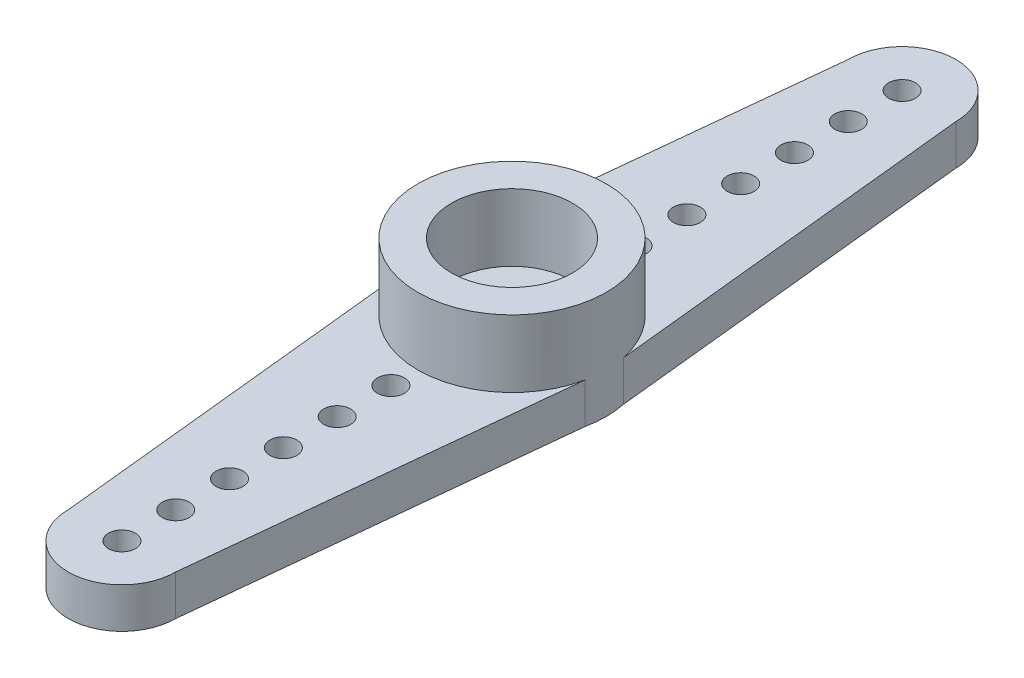
ISO-10303-21;
HEADER;
FILE_DESCRIPTION(('STEP AP214'),'2;1');
FILE_NAME('part.step','',(''),(''),'','','');
FILE_SCHEMA(('AUTOMOTIVE_DESIGN { 1 0 10303 214 1 1 1 1 }'));
ENDSEC;
DATA;
#1=APPLICATION_CONTEXT('core data for automotive mechanical design processes');
#2=APPLICATION_PROTOCOL_DEFINITION('international standard','automotive_design',2000,#1);
#3=PRODUCT_CONTEXT('',#1,'mechanical');
#4=PRODUCT('Part','Part','',(#3));
#5=PRODUCT_RELATED_PRODUCT_CATEGORY('part','',(#4));
#6=PRODUCT_DEFINITION_FORMATION('','',#4);
#7=PRODUCT_DEFINITION_CONTEXT('part definition',#1,'design');
#8=PRODUCT_DEFINITION('design','',#6,#7);
#9=PRODUCT_DEFINITION_SHAPE('','',#8);
#10=(LENGTH_UNIT() NAMED_UNIT(*) SI_UNIT(.MILLI.,.METRE.));
#11=(NAMED_UNIT(*) PLANE_ANGLE_UNIT() SI_UNIT($,.RADIAN.));
#12=(NAMED_UNIT(*) SI_UNIT($,.STERADIAN.) SOLID_ANGLE_UNIT());
#13=UNCERTAINTY_MEASURE_WITH_UNIT(LENGTH_MEASURE(1.E-05),#10,'distance_accuracy_value','');
#14=(GEOMETRIC_REPRESENTATION_CONTEXT(3) GLOBAL_UNCERTAINTY_ASSIGNED_CONTEXT((#13)) GLOBAL_UNIT_ASSIGNED_CONTEXT((#10,
#11,#12)) REPRESENTATION_CONTEXT('',''));
#15=CARTESIAN_POINT('',(0.,0.,0.));
#16=DIRECTION('',(0.,0.,1.));
#17=DIRECTION('',(1.,0.,0.));
#18=AXIS2_PLACEMENT_3D('',#15,#16,#17);
#19=CARTESIAN_POINT('',(0.,1.5,-14.5));
#20=DIRECTION('',(0.,1.,0.));
#21=DIRECTION('',(0.,0.,1.));
#22=AXIS2_PLACEMENT_3D('',#19,#20,#21);
#23=PLANE('',#22);
#24=CARTESIAN_POINT('',(0.,1.5,0.));
#25=DIRECTION('',(0.,1.,0.));
#26=DIRECTION('',(0.,0.,1.));
#27=AXIS2_PLACEMENT_3D('',#24,#25,#26);
#28=CIRCLE('',#27,3.5);
#29=CARTESIAN_POINT('',(3.42588235294118,1.5,-0.716470588235295));
#30=VERTEX_POINT('',#29);
#31=CARTESIAN_POINT('',(-3.42588235294118,1.5,-0.716470588235295));
#32=VERTEX_POINT('',#31);
#33=EDGE_CURVE('E11',#30,#32,#28,.T.);
#34=ORIENTED_EDGE('',*,*,#33,.F.);
#35=DIRECTION('',(-0.102899151085505,0.,-0.994691793826551));
#36=VECTOR('',#35,1.);
#37=CARTESIAN_POINT('',(2.,1.5,-14.5));
#38=LINE('',#37,#36);
#39=CARTESIAN_POINT('',(2.,1.5,-14.5));
#40=VERTEX_POINT('',#39);
#41=EDGE_CURVE('E51',#30,#40,#38,.T.);
#42=ORIENTED_EDGE('',*,*,#41,.T.);
#43=CARTESIAN_POINT('',(0.,1.5,-14.5));
#44=DIRECTION('',(0.,1.,0.));
#45=DIRECTION('',(0.,0.,1.));
#46=AXIS2_PLACEMENT_3D('',#43,#44,#45);
#47=CIRCLE('',#46,2.);
#48=CARTESIAN_POINT('',(-2.,1.5,-14.5));
#49=VERTEX_POINT('',#48);
#50=EDGE_CURVE('E157',#40,#49,#47,.T.);
#51=ORIENTED_EDGE('',*,*,#50,.T.);
#52=DIRECTION('',(-0.102899151085505,0.,0.994691793826551));
#53=VECTOR('',#52,1.);
#54=CARTESIAN_POINT('',(-2.,1.5,-14.5));
#55=LINE('',#54,#53);
#56=EDGE_CURVE('E96',#49,#32,#55,.T.);
#57=ORIENTED_EDGE('',*,*,#56,.T.);
#58=EDGE_LOOP('',(#34,#42,#51,#57));
#59=FACE_BOUND('',#58,.T.);
#60=CARTESIAN_POINT('',(1.04744440165294E-13,1.5,-4.50000000000001));
#61=DIRECTION('',(0.,1.,0.));
#62=DIRECTION('',(0.,0.,1.));
#63=AXIS2_PLACEMENT_3D('',#60,#61,#62);
#64=CIRCLE('',#63,0.5);
#65=CARTESIAN_POINT('',(1.04744440165294E-13,1.5,-4.00000000000001));
#66=VERTEX_POINT('',#65);
#67=EDGE_CURVE('E212',#66,#66,#64,.T.);
#68=ORIENTED_EDGE('',*,*,#67,.F.);
#69=EDGE_LOOP('',(#68));
#70=FACE_BOUND('',#69,.T.);
#71=CARTESIAN_POINT('',(0.,1.5,-8.50000000000001));
#72=DIRECTION('',(0.,1.,0.));
#73=DIRECTION('',(0.,0.,1.));
#74=AXIS2_PLACEMENT_3D('',#71,#72,#73);
#75=CIRCLE('',#74,0.5);
#76=CARTESIAN_POINT('',(0.,1.5,-8.00000000000001));
#77=VERTEX_POINT('',#76);
#78=EDGE_CURVE('E216',#77,#77,#75,.T.);
#79=ORIENTED_EDGE('',*,*,#78,.F.);
#80=EDGE_LOOP('',(#79));
#81=FACE_BOUND('',#80,.T.);
#82=CARTESIAN_POINT('',(0.,1.5,-12.5));
#83=DIRECTION('',(0.,1.,0.));
#84=DIRECTION('',(0.,0.,1.));
#85=AXIS2_PLACEMENT_3D('',#82,#83,#84);
#86=CIRCLE('',#85,0.5);
#87=CARTESIAN_POINT('',(0.,1.5,-12.));
#88=VERTEX_POINT('',#87);
#89=EDGE_CURVE('E220',#88,#88,#86,.T.);
#90=ORIENTED_EDGE('',*,*,#89,.F.);
#91=EDGE_LOOP('',(#90));
#92=FACE_BOUND('',#91,.T.);
#93=CARTESIAN_POINT('',(0.,1.5,-14.5));
#94=DIRECTION('',(0.,1.,0.));
#95=DIRECTION('',(0.,0.,1.));
#96=AXIS2_PLACEMENT_3D('',#93,#94,#95);
#97=CIRCLE('',#96,0.5);
#98=CARTESIAN_POINT('',(0.,1.5,-14.));
#99=VERTEX_POINT('',#98);
#100=EDGE_CURVE('E224',#99,#99,#97,.T.);
#101=ORIENTED_EDGE('',*,*,#100,.F.);
#102=EDGE_LOOP('',(#101));
#103=FACE_BOUND('',#102,.T.);
#104=CARTESIAN_POINT('',(0.,1.5,-10.5));
#105=DIRECTION('',(0.,1.,0.));
#106=DIRECTION('',(0.,0.,1.));
#107=AXIS2_PLACEMENT_3D('',#104,#105,#106);
#108=CIRCLE('',#107,0.5);
#109=CARTESIAN_POINT('',(0.,1.5,-10.));
#110=VERTEX_POINT('',#109);
#111=EDGE_CURVE('E228',#110,#110,#108,.T.);
#112=ORIENTED_EDGE('',*,*,#111,.F.);
#113=EDGE_LOOP('',(#112));
#114=FACE_BOUND('',#113,.T.);
#115=CARTESIAN_POINT('',(0.,1.5,-6.50000000000001));
#116=DIRECTION('',(0.,1.,0.));
#117=DIRECTION('',(0.,0.,1.));
#118=AXIS2_PLACEMENT_3D('',#115,#116,#117);
#119=CIRCLE('',#118,0.5);
#120=CARTESIAN_POINT('',(0.,1.5,-6.00000000000001));
#121=VERTEX_POINT('',#120);
#122=EDGE_CURVE('E231',#121,#121,#119,.T.);
#123=ORIENTED_EDGE('',*,*,#122,.F.);
#124=EDGE_LOOP('',(#123));
#125=FACE_BOUND('',#124,.T.);
#126=ADVANCED_FACE('F32',(#59,#70,#81,#92,#103,#114,#125),#23,.T.);
#127=CARTESIAN_POINT('',(-3.42588235294118,1.5,0.716470588235297));
#128=VERTEX_POINT('',#127);
#129=CARTESIAN_POINT('',(3.42588235294118,1.5,0.716470588235302));
#130=VERTEX_POINT('',#129);
#131=EDGE_CURVE('E42',#128,#130,#28,.T.);
#132=ORIENTED_EDGE('',*,*,#131,.F.);
#133=DIRECTION('',(0.102899151085505,0.,0.994691793826551));
#134=VECTOR('',#133,1.);
#135=CARTESIAN_POINT('',(-3.42588235294118,1.5,0.716470588235298));
#136=LINE('',#135,#134);
#137=CARTESIAN_POINT('',(-2.,1.5,14.5));
#138=VERTEX_POINT('',#137);
#139=EDGE_CURVE('E117',#128,#138,#136,.T.);
#140=ORIENTED_EDGE('',*,*,#139,.T.);
#141=CARTESIAN_POINT('',(0.,1.5,14.5));
#142=DIRECTION('',(0.,1.,0.));
#143=DIRECTION('',(0.,0.,1.));
#144=AXIS2_PLACEMENT_3D('',#141,#142,#143);
#145=CIRCLE('',#144,2.);
#146=CARTESIAN_POINT('',(2.,1.5,14.5));
#147=VERTEX_POINT('',#146);
#148=EDGE_CURVE('E109',#138,#147,#145,.T.);
#149=ORIENTED_EDGE('',*,*,#148,.T.);
#150=DIRECTION('',(0.102899151085505,0.,-0.994691793826551));
#151=VECTOR('',#150,1.);
#152=CARTESIAN_POINT('',(3.42588235294118,1.5,0.716470588235298));
#153=LINE('',#152,#151);
#154=EDGE_CURVE('E114',#147,#130,#153,.T.);
#155=ORIENTED_EDGE('',*,*,#154,.T.);
#156=EDGE_LOOP('',(#132,#140,#149,#155));
#157=FACE_BOUND('',#156,.T.);
#158=CARTESIAN_POINT('',(0.,1.5,6.5));
#159=DIRECTION('',(0.,1.,0.));
#160=DIRECTION('',(0.,0.,1.));
#161=AXIS2_PLACEMENT_3D('',#158,#159,#160);
#162=CIRCLE('',#161,0.5);
#163=CARTESIAN_POINT('',(0.,1.5,7.));
#164=VERTEX_POINT('',#163);
#165=EDGE_CURVE('E264',#164,#164,#162,.T.);
#166=ORIENTED_EDGE('',*,*,#165,.F.);
#167=EDGE_LOOP('',(#166));
#168=FACE_BOUND('',#167,.T.);
#169=CARTESIAN_POINT('',(0.,1.5,10.5));
#170=DIRECTION('',(0.,1.,0.));
#171=DIRECTION('',(0.,0.,1.));
#172=AXIS2_PLACEMENT_3D('',#169,#170,#171);
#173=CIRCLE('',#172,0.5);
#174=CARTESIAN_POINT('',(0.,1.5,11.));
#175=VERTEX_POINT('',#174);
#176=EDGE_CURVE('E276',#175,#175,#173,.T.);
#177=ORIENTED_EDGE('',*,*,#176,.F.);
#178=EDGE_LOOP('',(#177));
#179=FACE_BOUND('',#178,.T.);
#180=CARTESIAN_POINT('',(0.,1.5,14.5));
#181=DIRECTION('',(0.,1.,0.));
#182=DIRECTION('',(0.,0.,1.));
#183=AXIS2_PLACEMENT_3D('',#180,#181,#182);
#184=CIRCLE('',#183,0.5);
#185=CARTESIAN_POINT('',(0.,1.5,15.));
#186=VERTEX_POINT('',#185);
#187=EDGE_CURVE('E201',#186,#186,#184,.T.);
#188=ORIENTED_EDGE('',*,*,#187,.F.);
#189=EDGE_LOOP('',(#188));
#190=FACE_BOUND('',#189,.T.);
#191=CARTESIAN_POINT('',(0.,1.5,12.5));
#192=DIRECTION('',(0.,1.,0.));
#193=DIRECTION('',(0.,0.,1.));
#194=AXIS2_PLACEMENT_3D('',#191,#192,#193);
#195=CIRCLE('',#194,0.5);
#196=CARTESIAN_POINT('',(0.,1.5,13.));
#197=VERTEX_POINT('',#196);
#198=EDGE_CURVE('E282',#197,#197,#195,.T.);
#199=ORIENTED_EDGE('',*,*,#198,.F.);
#200=EDGE_LOOP('',(#199));
#201=FACE_BOUND('',#200,.T.);
#202=CARTESIAN_POINT('',(0.,1.5,8.5));
#203=DIRECTION('',(0.,1.,0.));
#204=DIRECTION('',(0.,0.,1.));
#205=AXIS2_PLACEMENT_3D('',#202,#203,#204);
#206=CIRCLE('',#205,0.5);
#207=CARTESIAN_POINT('',(0.,1.5,9.));
#208=VERTEX_POINT('',#207);
#209=EDGE_CURVE('E270',#208,#208,#206,.T.);
#210=ORIENTED_EDGE('',*,*,#209,.F.);
#211=EDGE_LOOP('',(#210));
#212=FACE_BOUND('',#211,.T.);
#213=CARTESIAN_POINT('',(0.,1.5,4.5));
#214=DIRECTION('',(0.,1.,0.));
#215=DIRECTION('',(0.,0.,1.));
#216=AXIS2_PLACEMENT_3D('',#213,#214,#215);
#217=CIRCLE('',#216,0.5);
#218=CARTESIAN_POINT('',(0.,1.5,5.));
#219=VERTEX_POINT('',#218);
#220=EDGE_CURVE('E258',#219,#219,#217,.T.);
#221=ORIENTED_EDGE('',*,*,#220,.F.);
#222=EDGE_LOOP('',(#221));
#223=FACE_BOUND('',#222,.T.);
#224=ADVANCED_FACE('F111',(#157,#168,#179,#190,#201,#212,#223),#23,.T.);
#225=CARTESIAN_POINT('',(0.,0.,-14.5));
#226=DIRECTION('',(0.,1.,0.));
#227=DIRECTION('',(0.,0.,1.));
#228=AXIS2_PLACEMENT_3D('',#225,#226,#227);
#229=PLANE('',#228);
#230=CARTESIAN_POINT('',(0.,0.,0.));
#231=DIRECTION('',(0.,-1.,0.));
#232=DIRECTION('',(0.,0.,-1.));
#233=AXIS2_PLACEMENT_3D('',#230,#231,#232);
#234=CIRCLE('',#233,2.5);
#235=CARTESIAN_POINT('',(0.,0.,-2.5));
#236=VERTEX_POINT('',#235);
#237=EDGE_CURVE('E536',#236,#236,#234,.T.);
#238=ORIENTED_EDGE('',*,*,#237,.F.);
#239=EDGE_LOOP('',(#238));
#240=FACE_BOUND('',#239,.T.);
#241=CARTESIAN_POINT('',(0.,0.,-6.50000000000001));
#242=DIRECTION('',(0.,1.,0.));
#243=DIRECTION('',(0.,0.,1.));
#244=AXIS2_PLACEMENT_3D('',#241,#242,#243);
#245=CIRCLE('',#244,0.5);
#246=CARTESIAN_POINT('',(0.,0.,-6.00000000000001));
#247=VERTEX_POINT('',#246);
#248=EDGE_CURVE('E234',#247,#247,#245,.T.);
#249=ORIENTED_EDGE('',*,*,#248,.T.);
#250=EDGE_LOOP('',(#249));
#251=FACE_BOUND('',#250,.T.);
#252=CARTESIAN_POINT('',(0.,0.,-10.5));
#253=DIRECTION('',(0.,1.,0.));
#254=DIRECTION('',(0.,0.,1.));
#255=AXIS2_PLACEMENT_3D('',#252,#253,#254);
#256=CIRCLE('',#255,0.5);
#257=CARTESIAN_POINT('',(0.,0.,-10.));
#258=VERTEX_POINT('',#257);
#259=EDGE_CURVE('E244',#258,#258,#256,.T.);
#260=ORIENTED_EDGE('',*,*,#259,.T.);
#261=EDGE_LOOP('',(#260));
#262=FACE_BOUND('',#261,.T.);
#263=CARTESIAN_POINT('',(0.,0.,-14.5));
#264=DIRECTION('',(0.,1.,0.));
#265=DIRECTION('',(0.,0.,1.));
#266=AXIS2_PLACEMENT_3D('',#263,#264,#265);
#267=CIRCLE('',#266,0.5);
#268=CARTESIAN_POINT('',(0.,0.,-14.));
#269=VERTEX_POINT('',#268);
#270=EDGE_CURVE('E251',#269,#269,#267,.T.);
#271=ORIENTED_EDGE('',*,*,#270,.T.);
#272=EDGE_LOOP('',(#271));
#273=FACE_BOUND('',#272,.T.);
#274=CARTESIAN_POINT('',(0.,0.,6.5));
#275=DIRECTION('',(0.,1.,0.));
#276=DIRECTION('',(0.,0.,1.));
#277=AXIS2_PLACEMENT_3D('',#274,#275,#276);
#278=CIRCLE('',#277,0.5);
#279=CARTESIAN_POINT('',(0.,0.,7.));
#280=VERTEX_POINT('',#279);
#281=EDGE_CURVE('E261',#280,#280,#278,.T.);
#282=ORIENTED_EDGE('',*,*,#281,.T.);
#283=EDGE_LOOP('',(#282));
#284=FACE_BOUND('',#283,.T.);
#285=CARTESIAN_POINT('',(0.,0.,10.5));
#286=DIRECTION('',(0.,1.,0.));
#287=DIRECTION('',(0.,0.,1.));
#288=AXIS2_PLACEMENT_3D('',#285,#286,#287);
#289=CIRCLE('',#288,0.5);
#290=CARTESIAN_POINT('',(0.,0.,11.));
#291=VERTEX_POINT('',#290);
#292=EDGE_CURVE('E273',#291,#291,#289,.T.);
#293=ORIENTED_EDGE('',*,*,#292,.T.);
#294=EDGE_LOOP('',(#293));
#295=FACE_BOUND('',#294,.T.);
#296=CARTESIAN_POINT('',(0.,0.,14.5));
#297=DIRECTION('',(0.,1.,0.));
#298=DIRECTION('',(0.,0.,1.));
#299=AXIS2_PLACEMENT_3D('',#296,#297,#298);
#300=CIRCLE('',#299,0.5);
#301=CARTESIAN_POINT('',(0.,0.,15.));
#302=VERTEX_POINT('',#301);
#303=EDGE_CURVE('E197',#302,#302,#300,.T.);
#304=ORIENTED_EDGE('',*,*,#303,.T.);
#305=EDGE_LOOP('',(#304));
#306=FACE_BOUND('',#305,.T.);
#307=CARTESIAN_POINT('',(0.,0.,-14.5));
#308=DIRECTION('',(0.,1.,0.));
#309=DIRECTION('',(0.,0.,1.));
#310=AXIS2_PLACEMENT_3D('',#307,#308,#309);
#311=CIRCLE('',#310,2.);
#312=CARTESIAN_POINT('',(2.,0.,-14.5));
#313=VERTEX_POINT('',#312);
#314=CARTESIAN_POINT('',(-2.,0.,-14.5));
#315=VERTEX_POINT('',#314);
#316=EDGE_CURVE('E200',#313,#315,#311,.T.);
#317=ORIENTED_EDGE('',*,*,#316,.F.);
#318=DIRECTION('',(-0.102899151085505,0.,-0.994691793826551));
#319=VECTOR('',#318,1.);
#320=CARTESIAN_POINT('',(2.,0.,-14.5));
#321=LINE('',#320,#319);
#322=CARTESIAN_POINT('',(3.42588235294118,0.,-0.716470588235295));
#323=VERTEX_POINT('',#322);
#324=EDGE_CURVE('E87',#323,#313,#321,.T.);
#325=ORIENTED_EDGE('',*,*,#324,.F.);
#326=CARTESIAN_POINT('',(0.,0.,0.));
#327=DIRECTION('',(0.,1.,0.));
#328=DIRECTION('',(0.,0.,1.));
#329=AXIS2_PLACEMENT_3D('',#326,#327,#328);
#330=CIRCLE('',#329,3.5);
#331=CARTESIAN_POINT('',(3.42588235294118,0.,0.716470588235298));
#332=VERTEX_POINT('',#331);
#333=EDGE_CURVE('E81',#332,#323,#330,.T.);
#334=ORIENTED_EDGE('',*,*,#333,.F.);
#335=DIRECTION('',(0.102899151085505,0.,-0.994691793826551));
#336=VECTOR('',#335,1.);
#337=CARTESIAN_POINT('',(3.42588235294118,0.,0.716470588235298));
#338=LINE('',#337,#336);
#339=CARTESIAN_POINT('',(2.,0.,14.5));
#340=VERTEX_POINT('',#339);
#341=EDGE_CURVE('E188',#340,#332,#338,.T.);
#342=ORIENTED_EDGE('',*,*,#341,.F.);
#343=CARTESIAN_POINT('',(0.,0.,14.5));
#344=DIRECTION('',(0.,1.,0.));
#345=DIRECTION('',(0.,0.,1.));
#346=AXIS2_PLACEMENT_3D('',#343,#344,#345);
#347=CIRCLE('',#346,2.);
#348=CARTESIAN_POINT('',(-2.,0.,14.5));
#349=VERTEX_POINT('',#348);
#350=EDGE_CURVE('E126',#349,#340,#347,.T.);
#351=ORIENTED_EDGE('',*,*,#350,.F.);
#352=DIRECTION('',(0.102899151085505,0.,0.994691793826551));
#353=VECTOR('',#352,1.);
#354=CARTESIAN_POINT('',(-3.42588235294118,0.,0.716470588235298));
#355=LINE('',#354,#353);
#356=CARTESIAN_POINT('',(-3.42588235294118,0.,0.716470588235297));
#357=VERTEX_POINT('',#356);
#358=EDGE_CURVE('E181',#357,#349,#355,.T.);
#359=ORIENTED_EDGE('',*,*,#358,.F.);
#360=CARTESIAN_POINT('',(0.,0.,0.));
#361=DIRECTION('',(0.,1.,0.));
#362=DIRECTION('',(0.,0.,1.));
#363=AXIS2_PLACEMENT_3D('',#360,#361,#362);
#364=CIRCLE('',#363,3.5);
#365=CARTESIAN_POINT('',(-3.42588235294118,0.,-0.716470588235295));
#366=VERTEX_POINT('',#365);
#367=EDGE_CURVE('E186',#366,#357,#364,.T.);
#368=ORIENTED_EDGE('',*,*,#367,.F.);
#369=DIRECTION('',(-0.102899151085505,0.,0.994691793826551));
#370=VECTOR('',#369,1.);
#371=CARTESIAN_POINT('',(-2.,0.,-14.5));
#372=LINE('',#371,#370);
#373=EDGE_CURVE('E190',#315,#366,#372,.T.);
#374=ORIENTED_EDGE('',*,*,#373,.F.);
#375=EDGE_LOOP('',(#317,#325,#334,#342,#351,#359,#368,#374));
#376=FACE_BOUND('',#375,.T.);
#377=CARTESIAN_POINT('',(0.,0.,12.5));
#378=DIRECTION('',(0.,1.,0.));
#379=DIRECTION('',(0.,0.,1.));
#380=AXIS2_PLACEMENT_3D('',#377,#378,#379);
#381=CIRCLE('',#380,0.5);
#382=CARTESIAN_POINT('',(0.,0.,13.));
#383=VERTEX_POINT('',#382);
#384=EDGE_CURVE('E279',#383,#383,#381,.T.);
#385=ORIENTED_EDGE('',*,*,#384,.T.);
#386=EDGE_LOOP('',(#385));
#387=FACE_BOUND('',#386,.T.);
#388=CARTESIAN_POINT('',(0.,0.,8.5));
#389=DIRECTION('',(0.,1.,0.));
#390=DIRECTION('',(0.,0.,1.));
#391=AXIS2_PLACEMENT_3D('',#388,#389,#390);
#392=CIRCLE('',#391,0.5);
#393=CARTESIAN_POINT('',(0.,0.,9.));
#394=VERTEX_POINT('',#393);
#395=EDGE_CURVE('E267',#394,#394,#392,.T.);
#396=ORIENTED_EDGE('',*,*,#395,.T.);
#397=EDGE_LOOP('',(#396));
#398=FACE_BOUND('',#397,.T.);
#399=CARTESIAN_POINT('',(0.,0.,4.5));
#400=DIRECTION('',(0.,1.,0.));
#401=DIRECTION('',(0.,0.,1.));
#402=AXIS2_PLACEMENT_3D('',#399,#400,#401);
#403=CIRCLE('',#402,0.5);
#404=CARTESIAN_POINT('',(0.,0.,5.));
#405=VERTEX_POINT('',#404);
#406=EDGE_CURVE('E255',#405,#405,#403,.T.);
#407=ORIENTED_EDGE('',*,*,#406,.T.);
#408=EDGE_LOOP('',(#407));
#409=FACE_BOUND('',#408,.T.);
#410=CARTESIAN_POINT('',(0.,0.,-12.5));
#411=DIRECTION('',(0.,1.,0.));
#412=DIRECTION('',(0.,0.,1.));
#413=AXIS2_PLACEMENT_3D('',#410,#411,#412);
#414=CIRCLE('',#413,0.5);
#415=CARTESIAN_POINT('',(0.,0.,-12.));
#416=VERTEX_POINT('',#415);
#417=EDGE_CURVE('E247',#416,#416,#414,.T.);
#418=ORIENTED_EDGE('',*,*,#417,.T.);
#419=EDGE_LOOP('',(#418));
#420=FACE_BOUND('',#419,.T.);
#421=CARTESIAN_POINT('',(0.,0.,-8.50000000000001));
#422=DIRECTION('',(0.,1.,0.));
#423=DIRECTION('',(0.,0.,1.));
#424=AXIS2_PLACEMENT_3D('',#421,#422,#423);
#425=CIRCLE('',#424,0.5);
#426=CARTESIAN_POINT('',(0.,0.,-8.00000000000001));
#427=VERTEX_POINT('',#426);
#428=EDGE_CURVE('E233',#427,#427,#425,.T.);
#429=ORIENTED_EDGE('',*,*,#428,.T.);
#430=EDGE_LOOP('',(#429));
#431=FACE_BOUND('',#430,.T.);
#432=CARTESIAN_POINT('',(1.04744440165294E-13,0.,-4.50000000000001));
#433=DIRECTION('',(0.,1.,0.));
#434=DIRECTION('',(0.,0.,1.));
#435=AXIS2_PLACEMENT_3D('',#432,#433,#434);
#436=CIRCLE('',#435,0.5);
#437=CARTESIAN_POINT('',(1.04744440165294E-13,0.,-4.00000000000001));
#438=VERTEX_POINT('',#437);
#439=EDGE_CURVE('E241',#438,#438,#436,.T.);
#440=ORIENTED_EDGE('',*,*,#439,.T.);
#441=EDGE_LOOP('',(#440));
#442=FACE_BOUND('',#441,.T.);
#443=ADVANCED_FACE('F184',(#240,#251,#262,#273,#284,#295,#306,#376,#387,#398,#409,#420,#431,
#442),#229,.F.);
#444=CARTESIAN_POINT('',(0.,1.5,-14.5));
#445=DIRECTION('',(0.,-1.,0.));
#446=DIRECTION('',(0.,0.,-1.));
#447=AXIS2_PLACEMENT_3D('',#444,#445,#446);
#448=CYLINDRICAL_SURFACE('',#447,2.);
#449=ORIENTED_EDGE('',*,*,#316,.T.);
#450=DIRECTION('',(0.,-1.,0.));
#451=VECTOR('',#450,1.);
#452=CARTESIAN_POINT('',(-2.,1.5,-14.5));
#453=LINE('',#452,#451);
#454=EDGE_CURVE('E145',#49,#315,#453,.T.);
#455=ORIENTED_EDGE('',*,*,#454,.F.);
#456=ORIENTED_EDGE('',*,*,#50,.F.);
#457=DIRECTION('',(0.,-1.,0.));
#458=VECTOR('',#457,1.);
#459=CARTESIAN_POINT('',(2.,1.5,-14.5));
#460=LINE('',#459,#458);
#461=EDGE_CURVE('E135',#40,#313,#460,.T.);
#462=ORIENTED_EDGE('',*,*,#461,.T.);
#463=EDGE_LOOP('',(#449,#455,#456,#462));
#464=FACE_BOUND('',#463,.T.);
#465=ADVANCED_FACE('F34',(#464),#448,.T.);
#466=CARTESIAN_POINT('',(-2.,1.5,-14.5));
#467=DIRECTION('',(0.994691793826551,0.,0.102899151085505));
#468=DIRECTION('',(0.102899151085505,0.,-0.994691793826551));
#469=AXIS2_PLACEMENT_3D('',#466,#467,#468);
#470=PLANE('',#469);
#471=ORIENTED_EDGE('',*,*,#373,.T.);
#472=DIRECTION('',(0.,-1.,0.));
#473=VECTOR('',#472,1.);
#474=CARTESIAN_POINT('',(-3.42588235294118,1.5,-0.716470588235295));
#475=LINE('',#474,#473);
#476=EDGE_CURVE('E160',#32,#366,#475,.T.);
#477=ORIENTED_EDGE('',*,*,#476,.F.);
#478=ORIENTED_EDGE('',*,*,#56,.F.);
#479=ORIENTED_EDGE('',*,*,#454,.T.);
#480=EDGE_LOOP('',(#471,#477,#478,#479));
#481=FACE_BOUND('',#480,.T.);
#482=ADVANCED_FACE('F202',(#481),#470,.F.);
#483=CARTESIAN_POINT('',(-3.42588235294118,1.5,0.716470588235298));
#484=DIRECTION('',(0.994691793826551,0.,-0.102899151085505));
#485=DIRECTION('',(-0.102899151085505,0.,-0.994691793826551));
#486=AXIS2_PLACEMENT_3D('',#483,#484,#485);
#487=PLANE('',#486);
#488=ORIENTED_EDGE('',*,*,#358,.T.);
#489=DIRECTION('',(0.,-1.,0.));
#490=VECTOR('',#489,1.);
#491=CARTESIAN_POINT('',(-2.,1.5,14.5));
#492=LINE('',#491,#490);
#493=EDGE_CURVE('E129',#138,#349,#492,.T.);
#494=ORIENTED_EDGE('',*,*,#493,.F.);
#495=ORIENTED_EDGE('',*,*,#139,.F.);
#496=DIRECTION('',(0.,-1.,0.));
#497=VECTOR('',#496,1.);
#498=CARTESIAN_POINT('',(-3.42588235294118,1.5,0.716470588235297));
#499=LINE('',#498,#497);
#500=EDGE_CURVE('E146',#128,#357,#499,.T.);
#501=ORIENTED_EDGE('',*,*,#500,.T.);
#502=EDGE_LOOP('',(#488,#494,#495,#501));
#503=FACE_BOUND('',#502,.T.);
#504=ADVANCED_FACE('F180',(#503),#487,.F.);
#505=CARTESIAN_POINT('',(0.,1.5,14.5));
#506=DIRECTION('',(0.,-1.,0.));
#507=DIRECTION('',(0.,0.,-1.));
#508=AXIS2_PLACEMENT_3D('',#505,#506,#507);
#509=CYLINDRICAL_SURFACE('',#508,2.);
#510=ORIENTED_EDGE('',*,*,#350,.T.);
#511=DIRECTION('',(0.,-1.,0.));
#512=VECTOR('',#511,1.);
#513=CARTESIAN_POINT('',(2.,1.5,14.5));
#514=LINE('',#513,#512);
#515=EDGE_CURVE('E123',#147,#340,#514,.T.);
#516=ORIENTED_EDGE('',*,*,#515,.F.);
#517=ORIENTED_EDGE('',*,*,#148,.F.);
#518=ORIENTED_EDGE('',*,*,#493,.T.);
#519=EDGE_LOOP('',(#510,#516,#517,#518));
#520=FACE_BOUND('',#519,.T.);
#521=ADVANCED_FACE('F124',(#520),#509,.T.);
#522=CARTESIAN_POINT('',(3.42588235294118,1.5,0.716470588235298));
#523=DIRECTION('',(-0.994691793826551,0.,-0.102899151085505));
#524=DIRECTION('',(-0.102899151085505,0.,0.994691793826551));
#525=AXIS2_PLACEMENT_3D('',#522,#523,#524);
#526=PLANE('',#525);
#527=ORIENTED_EDGE('',*,*,#341,.T.);
#528=DIRECTION('',(0.,-1.,0.));
#529=VECTOR('',#528,1.);
#530=CARTESIAN_POINT('',(3.42588235294118,1.5,0.716470588235298));
#531=LINE('',#530,#529);
#532=EDGE_CURVE('E130',#130,#332,#531,.T.);
#533=ORIENTED_EDGE('',*,*,#532,.F.);
#534=ORIENTED_EDGE('',*,*,#154,.F.);
#535=ORIENTED_EDGE('',*,*,#515,.T.);
#536=EDGE_LOOP('',(#527,#533,#534,#535));
#537=FACE_BOUND('',#536,.T.);
#538=ADVANCED_FACE('F133',(#537),#526,.F.);
#539=CARTESIAN_POINT('',(0.,1.5,0.));
#540=DIRECTION('',(0.,-1.,0.));
#541=DIRECTION('',(0.,0.,-1.));
#542=AXIS2_PLACEMENT_3D('',#539,#540,#541);
#543=CYLINDRICAL_SURFACE('',#542,3.5);
#544=ORIENTED_EDGE('',*,*,#333,.T.);
#545=DIRECTION('',(0.,-1.,0.));
#546=VECTOR('',#545,1.);
#547=CARTESIAN_POINT('',(3.42588235294118,1.5,-0.716470588235295));
#548=LINE('',#547,#546);
#549=EDGE_CURVE('E165',#30,#323,#548,.T.);
#550=ORIENTED_EDGE('',*,*,#549,.F.);
#551=ORIENTED_EDGE('',*,*,#33,.T.);
#552=ORIENTED_EDGE('',*,*,#476,.T.);
#553=ORIENTED_EDGE('',*,*,#367,.T.);
#554=ORIENTED_EDGE('',*,*,#500,.F.);
#555=ORIENTED_EDGE('',*,*,#131,.T.);
#556=ORIENTED_EDGE('',*,*,#532,.T.);
#557=EDGE_LOOP('',(#544,#550,#551,#552,#553,#554,#555,#556));
#558=FACE_BOUND('',#557,.T.);
#559=CARTESIAN_POINT('',(0.,4.,0.));
#560=DIRECTION('',(0.,1.,0.));
#561=DIRECTION('',(0.,0.,1.));
#562=AXIS2_PLACEMENT_3D('',#559,#560,#561);
#563=CIRCLE('',#562,3.5);
#564=CARTESIAN_POINT('',(0.,4.,3.5));
#565=VERTEX_POINT('',#564);
#566=EDGE_CURVE('E547',#565,#565,#563,.T.);
#567=ORIENTED_EDGE('',*,*,#566,.F.);
#568=EDGE_LOOP('',(#567));
#569=FACE_BOUND('',#568,.T.);
#570=ADVANCED_FACE('F203',(#558,#569),#543,.T.);
#571=CARTESIAN_POINT('',(2.,1.5,-14.5));
#572=DIRECTION('',(-0.994691793826551,0.,0.102899151085505));
#573=DIRECTION('',(0.102899151085505,0.,0.994691793826551));
#574=AXIS2_PLACEMENT_3D('',#571,#572,#573);
#575=PLANE('',#574);
#576=ORIENTED_EDGE('',*,*,#324,.T.);
#577=ORIENTED_EDGE('',*,*,#461,.F.);
#578=ORIENTED_EDGE('',*,*,#41,.F.);
#579=ORIENTED_EDGE('',*,*,#549,.T.);
#580=EDGE_LOOP('',(#576,#577,#578,#579));
#581=FACE_BOUND('',#580,.T.);
#582=ADVANCED_FACE('F296',(#581),#575,.F.);
#583=CARTESIAN_POINT('',(0.,1.5,14.5));
#584=DIRECTION('',(0.,-1.,0.));
#585=DIRECTION('',(0.,0.,-1.));
#586=AXIS2_PLACEMENT_3D('',#583,#584,#585);
#587=CYLINDRICAL_SURFACE('',#586,0.5);
#588=ORIENTED_EDGE('',*,*,#187,.T.);
#589=EDGE_LOOP('',(#588));
#590=FACE_BOUND('',#589,.T.);
#591=ORIENTED_EDGE('',*,*,#303,.F.);
#592=EDGE_LOOP('',(#591));
#593=FACE_BOUND('',#592,.T.);
#594=ADVANCED_FACE('F293',(#590,#593),#587,.F.);
#595=CARTESIAN_POINT('',(0.,1.5,12.5));
#596=DIRECTION('',(0.,-1.,0.));
#597=DIRECTION('',(0.,0.,-1.));
#598=AXIS2_PLACEMENT_3D('',#595,#596,#597);
#599=CYLINDRICAL_SURFACE('',#598,0.5);
#600=ORIENTED_EDGE('',*,*,#198,.T.);
#601=EDGE_LOOP('',(#600));
#602=FACE_BOUND('',#601,.T.);
#603=ORIENTED_EDGE('',*,*,#384,.F.);
#604=EDGE_LOOP('',(#603));
#605=FACE_BOUND('',#604,.T.);
#606=ADVANCED_FACE('F295',(#602,#605),#599,.F.);
#607=CARTESIAN_POINT('',(0.,1.5,10.5));
#608=DIRECTION('',(0.,-1.,0.));
#609=DIRECTION('',(0.,0.,-1.));
#610=AXIS2_PLACEMENT_3D('',#607,#608,#609);
#611=CYLINDRICAL_SURFACE('',#610,0.5);
#612=ORIENTED_EDGE('',*,*,#176,.T.);
#613=EDGE_LOOP('',(#612));
#614=FACE_BOUND('',#613,.T.);
#615=ORIENTED_EDGE('',*,*,#292,.F.);
#616=EDGE_LOOP('',(#615));
#617=FACE_BOUND('',#616,.T.);
#618=ADVANCED_FACE('F302',(#614,#617),#611,.F.);
#619=CARTESIAN_POINT('',(0.,1.5,8.5));
#620=DIRECTION('',(0.,-1.,0.));
#621=DIRECTION('',(0.,0.,-1.));
#622=AXIS2_PLACEMENT_3D('',#619,#620,#621);
#623=CYLINDRICAL_SURFACE('',#622,0.5);
#624=ORIENTED_EDGE('',*,*,#209,.T.);
#625=EDGE_LOOP('',(#624));
#626=FACE_BOUND('',#625,.T.);
#627=ORIENTED_EDGE('',*,*,#395,.F.);
#628=EDGE_LOOP('',(#627));
#629=FACE_BOUND('',#628,.T.);
#630=ADVANCED_FACE('F423',(#626,#629),#623,.F.);
#631=CARTESIAN_POINT('',(0.,1.5,6.5));
#632=DIRECTION('',(0.,-1.,0.));
#633=DIRECTION('',(0.,0.,-1.));
#634=AXIS2_PLACEMENT_3D('',#631,#632,#633);
#635=CYLINDRICAL_SURFACE('',#634,0.5);
#636=ORIENTED_EDGE('',*,*,#165,.T.);
#637=EDGE_LOOP('',(#636));
#638=FACE_BOUND('',#637,.T.);
#639=ORIENTED_EDGE('',*,*,#281,.F.);
#640=EDGE_LOOP('',(#639));
#641=FACE_BOUND('',#640,.T.);
#642=ADVANCED_FACE('F413',(#638,#641),#635,.F.);
#643=CARTESIAN_POINT('',(0.,1.5,4.5));
#644=DIRECTION('',(0.,-1.,0.));
#645=DIRECTION('',(0.,0.,-1.));
#646=AXIS2_PLACEMENT_3D('',#643,#644,#645);
#647=CYLINDRICAL_SURFACE('',#646,0.5);
#648=ORIENTED_EDGE('',*,*,#220,.T.);
#649=EDGE_LOOP('',(#648));
#650=FACE_BOUND('',#649,.T.);
#651=ORIENTED_EDGE('',*,*,#406,.F.);
#652=EDGE_LOOP('',(#651));
#653=FACE_BOUND('',#652,.T.);
#654=ADVANCED_FACE('F403',(#650,#653),#647,.F.);
#655=CARTESIAN_POINT('',(0.,1.5,-14.5));
#656=DIRECTION('',(0.,-1.,0.));
#657=DIRECTION('',(0.,0.,-1.));
#658=AXIS2_PLACEMENT_3D('',#655,#656,#657);
#659=CYLINDRICAL_SURFACE('',#658,0.5);
#660=ORIENTED_EDGE('',*,*,#100,.T.);
#661=EDGE_LOOP('',(#660));
#662=FACE_BOUND('',#661,.T.);
#663=ORIENTED_EDGE('',*,*,#270,.F.);
#664=EDGE_LOOP('',(#663));
#665=FACE_BOUND('',#664,.T.);
#666=ADVANCED_FACE('F393',(#662,#665),#659,.F.);
#667=CARTESIAN_POINT('',(0.,1.5,-12.5));
#668=DIRECTION('',(0.,-1.,0.));
#669=DIRECTION('',(0.,0.,-1.));
#670=AXIS2_PLACEMENT_3D('',#667,#668,#669);
#671=CYLINDRICAL_SURFACE('',#670,0.5);
#672=ORIENTED_EDGE('',*,*,#89,.T.);
#673=EDGE_LOOP('',(#672));
#674=FACE_BOUND('',#673,.T.);
#675=ORIENTED_EDGE('',*,*,#417,.F.);
#676=EDGE_LOOP('',(#675));
#677=FACE_BOUND('',#676,.T.);
#678=ADVANCED_FACE('F383',(#674,#677),#671,.F.);
#679=CARTESIAN_POINT('',(0.,1.5,-10.5));
#680=DIRECTION('',(0.,-1.,0.));
#681=DIRECTION('',(0.,0.,-1.));
#682=AXIS2_PLACEMENT_3D('',#679,#680,#681);
#683=CYLINDRICAL_SURFACE('',#682,0.5);
#684=ORIENTED_EDGE('',*,*,#111,.T.);
#685=EDGE_LOOP('',(#684));
#686=FACE_BOUND('',#685,.T.);
#687=ORIENTED_EDGE('',*,*,#259,.F.);
#688=EDGE_LOOP('',(#687));
#689=FACE_BOUND('',#688,.T.);
#690=ADVANCED_FACE('F373',(#686,#689),#683,.F.);
#691=CARTESIAN_POINT('',(0.,1.5,-8.50000000000001));
#692=DIRECTION('',(0.,-1.,0.));
#693=DIRECTION('',(0.,0.,-1.));
#694=AXIS2_PLACEMENT_3D('',#691,#692,#693);
#695=CYLINDRICAL_SURFACE('',#694,0.5);
#696=ORIENTED_EDGE('',*,*,#78,.T.);
#697=EDGE_LOOP('',(#696));
#698=FACE_BOUND('',#697,.T.);
#699=ORIENTED_EDGE('',*,*,#428,.F.);
#700=EDGE_LOOP('',(#699));
#701=FACE_BOUND('',#700,.T.);
#702=ADVANCED_FACE('F364',(#698,#701),#695,.F.);
#703=CARTESIAN_POINT('',(0.,1.5,-6.50000000000001));
#704=DIRECTION('',(0.,-1.,0.));
#705=DIRECTION('',(0.,0.,-1.));
#706=AXIS2_PLACEMENT_3D('',#703,#704,#705);
#707=CYLINDRICAL_SURFACE('',#706,0.5);
#708=ORIENTED_EDGE('',*,*,#122,.T.);
#709=EDGE_LOOP('',(#708));
#710=FACE_BOUND('',#709,.T.);
#711=ORIENTED_EDGE('',*,*,#248,.F.);
#712=EDGE_LOOP('',(#711));
#713=FACE_BOUND('',#712,.T.);
#714=ADVANCED_FACE('F353',(#710,#713),#707,.F.);
#715=CARTESIAN_POINT('',(1.04744440165294E-13,1.5,-4.50000000000001));
#716=DIRECTION('',(0.,-1.,0.));
#717=DIRECTION('',(0.,0.,-1.));
#718=AXIS2_PLACEMENT_3D('',#715,#716,#717);
#719=CYLINDRICAL_SURFACE('',#718,0.5);
#720=ORIENTED_EDGE('',*,*,#67,.T.);
#721=EDGE_LOOP('',(#720));
#722=FACE_BOUND('',#721,.T.);
#723=ORIENTED_EDGE('',*,*,#439,.F.);
#724=EDGE_LOOP('',(#723));
#725=FACE_BOUND('',#724,.T.);
#726=ADVANCED_FACE('F347',(#722,#725),#719,.F.);
#727=CARTESIAN_POINT('',(0.,4.,0.));
#728=DIRECTION('',(0.,1.,0.));
#729=DIRECTION('',(0.,0.,1.));
#730=AXIS2_PLACEMENT_3D('',#727,#728,#729);
#731=PLANE('',#730);
#732=ORIENTED_EDGE('',*,*,#566,.T.);
#733=EDGE_LOOP('',(#732));
#734=FACE_BOUND('',#733,.T.);
#735=CARTESIAN_POINT('',(0.,4.,0.));
#736=DIRECTION('',(0.,1.,0.));
#737=DIRECTION('',(0.,0.,1.));
#738=AXIS2_PLACEMENT_3D('',#735,#736,#737);
#739=CIRCLE('',#738,2.25);
#740=CARTESIAN_POINT('',(0.,4.,2.25));
#741=VERTEX_POINT('',#740);
#742=EDGE_CURVE('E544',#741,#741,#739,.T.);
#743=ORIENTED_EDGE('',*,*,#742,.F.);
#744=EDGE_LOOP('',(#743));
#745=FACE_BOUND('',#744,.T.);
#746=ADVANCED_FACE('F352',(#734,#745),#731,.T.);
#747=CARTESIAN_POINT('',(0.,4.,0.));
#748=DIRECTION('',(0.,-1.,0.));
#749=DIRECTION('',(0.,0.,-1.));
#750=AXIS2_PLACEMENT_3D('',#747,#748,#749);
#751=CYLINDRICAL_SURFACE('',#750,2.25);
#752=ORIENTED_EDGE('',*,*,#742,.T.);
#753=EDGE_LOOP('',(#752));
#754=FACE_BOUND('',#753,.T.);
#755=CARTESIAN_POINT('',(0.,1.5,0.));
#756=DIRECTION('',(0.,1.,0.));
#757=DIRECTION('',(0.,0.,1.));
#758=AXIS2_PLACEMENT_3D('',#755,#756,#757);
#759=CIRCLE('',#758,2.25);
#760=CARTESIAN_POINT('',(0.,1.5,2.25));
#761=VERTEX_POINT('',#760);
#762=EDGE_CURVE('E541',#761,#761,#759,.T.);
#763=ORIENTED_EDGE('',*,*,#762,.F.);
#764=EDGE_LOOP('',(#763));
#765=FACE_BOUND('',#764,.T.);
#766=ADVANCED_FACE('F481',(#754,#765),#751,.F.);
#767=CARTESIAN_POINT('',(0.,1.5,0.));
#768=DIRECTION('',(0.,1.,0.));
#769=DIRECTION('',(0.,0.,1.));
#770=AXIS2_PLACEMENT_3D('',#767,#768,#769);
#771=CIRCLE('',#770,1.);
#772=CARTESIAN_POINT('',(0.,1.5,1.));
#773=VERTEX_POINT('',#772);
#774=EDGE_CURVE('E534',#773,#773,#771,.T.);
#775=ORIENTED_EDGE('',*,*,#774,.F.);
#776=EDGE_LOOP('',(#775));
#777=FACE_BOUND('',#776,.T.);
#778=ORIENTED_EDGE('',*,*,#762,.T.);
#779=EDGE_LOOP('',(#778));
#780=FACE_BOUND('',#779,.T.);
#781=ADVANCED_FACE('F208',(#777,#780),#23,.T.);
#782=CARTESIAN_POINT('',(0.,1.,0.));
#783=DIRECTION('',(0.,-1.,0.));
#784=DIRECTION('',(0.,0.,-1.));
#785=AXIS2_PLACEMENT_3D('',#782,#783,#784);
#786=CYLINDRICAL_SURFACE('',#785,2.5);
#787=CARTESIAN_POINT('',(0.,1.,0.));
#788=DIRECTION('',(0.,-1.,0.));
#789=DIRECTION('',(0.,0.,-1.));
#790=AXIS2_PLACEMENT_3D('',#787,#788,#789);
#791=CIRCLE('',#790,2.5);
#792=CARTESIAN_POINT('',(0.,1.,-2.5));
#793=VERTEX_POINT('',#792);
#794=EDGE_CURVE('E538',#793,#793,#791,.T.);
#795=ORIENTED_EDGE('',*,*,#794,.F.);
#796=EDGE_LOOP('',(#795));
#797=FACE_BOUND('',#796,.T.);
#798=ORIENTED_EDGE('',*,*,#237,.T.);
#799=EDGE_LOOP('',(#798));
#800=FACE_BOUND('',#799,.T.);
#801=ADVANCED_FACE('F500',(#797,#800),#786,.F.);
#802=CARTESIAN_POINT('',(0.,1.,0.));
#803=DIRECTION('',(0.,-1.,0.));
#804=DIRECTION('',(0.,0.,-1.));
#805=AXIS2_PLACEMENT_3D('',#802,#803,#804);
#806=PLANE('',#805);
#807=CARTESIAN_POINT('',(0.,1.,0.));
#808=DIRECTION('',(0.,-1.,0.));
#809=DIRECTION('',(0.,0.,-1.));
#810=AXIS2_PLACEMENT_3D('',#807,#808,#809);
#811=CIRCLE('',#810,1.);
#812=CARTESIAN_POINT('',(0.,1.,-1.));
#813=VERTEX_POINT('',#812);
#814=EDGE_CURVE('E36',#813,#813,#811,.T.);
#815=ORIENTED_EDGE('',*,*,#814,.F.);
#816=EDGE_LOOP('',(#815));
#817=FACE_BOUND('',#816,.T.);
#818=ORIENTED_EDGE('',*,*,#794,.T.);
#819=EDGE_LOOP('',(#818));
#820=FACE_BOUND('',#819,.T.);
#821=ADVANCED_FACE('F506',(#817,#820),#806,.T.);
#822=CARTESIAN_POINT('',(0.,0.5,0.));
#823=DIRECTION('',(0.,1.,0.));
#824=DIRECTION('',(0.,0.,1.));
#825=AXIS2_PLACEMENT_3D('',#822,#823,#824);
#826=CYLINDRICAL_SURFACE('',#825,1.);
#827=ORIENTED_EDGE('',*,*,#814,.T.);
#828=EDGE_LOOP('',(#827));
#829=FACE_BOUND('',#828,.T.);
#830=ORIENTED_EDGE('',*,*,#774,.T.);
#831=EDGE_LOOP('',(#830));
#832=FACE_BOUND('',#831,.T.);
#833=ADVANCED_FACE('F512',(#829,#832),#826,.F.);
#834=CLOSED_SHELL('',(#126,#224,#443,#465,#482,#504,#521,#538,#570,#582,#594,#606,#618,#630,
#642,#654,#666,#678,#690,#702,#714,#726,#746,#766,#781,#801,#821,#833));
#835=MANIFOLD_SOLID_BREP('B2',#834);
#836=ADVANCED_BREP_SHAPE_REPRESENTATION('',(#18,#835),#14);
#837=SHAPE_DEFINITION_REPRESENTATION(#9,#836);
ENDSEC;
END-ISO-10303-21;
